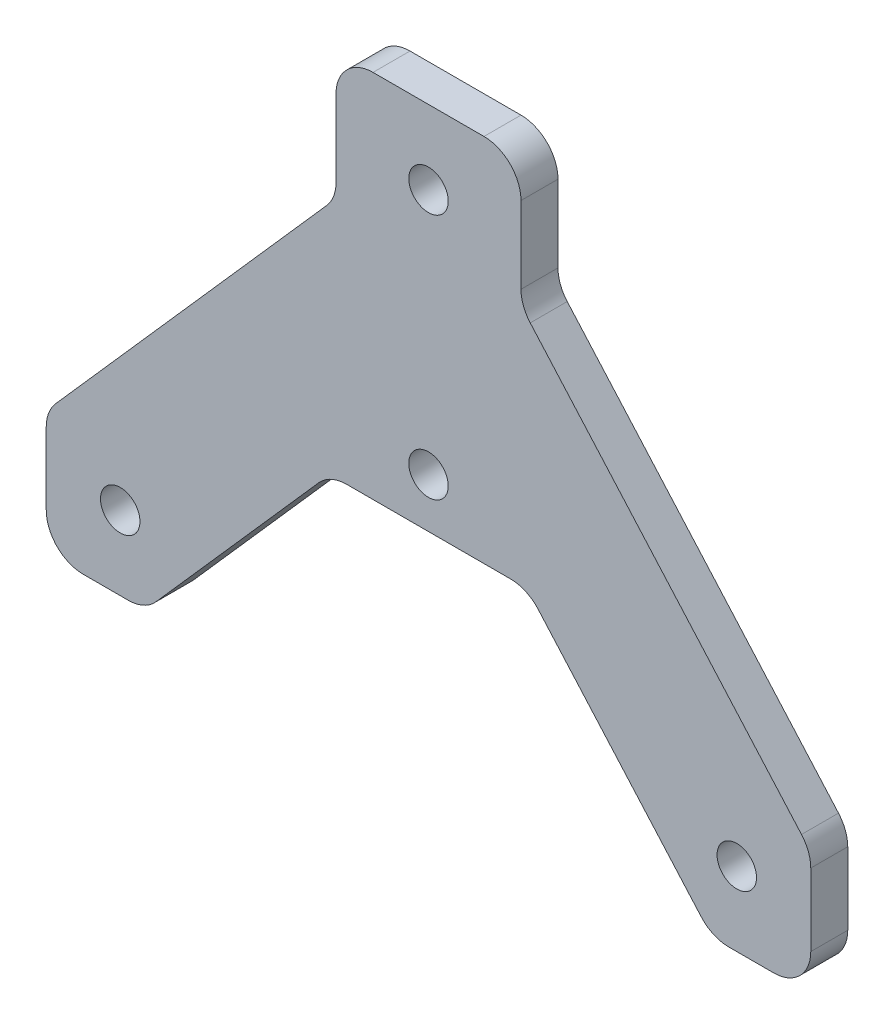
ISO-10303-21;
HEADER;
FILE_DESCRIPTION(('STEP AP214'),'2;1');
FILE_NAME('part.step','',(''),(''),'','','');
FILE_SCHEMA(('AUTOMOTIVE_DESIGN { 1 0 10303 214 1 1 1 1 }'));
ENDSEC;
DATA;
#1=APPLICATION_CONTEXT('core data for automotive mechanical design processes');
#2=APPLICATION_PROTOCOL_DEFINITION('international standard','automotive_design',2000,#1);
#3=PRODUCT_CONTEXT('',#1,'mechanical');
#4=PRODUCT('Part','Part','',(#3));
#5=PRODUCT_RELATED_PRODUCT_CATEGORY('part','',(#4));
#6=PRODUCT_DEFINITION_FORMATION('','',#4);
#7=PRODUCT_DEFINITION_CONTEXT('part definition',#1,'design');
#8=PRODUCT_DEFINITION('design','',#6,#7);
#9=PRODUCT_DEFINITION_SHAPE('','',#8);
#10=(LENGTH_UNIT() NAMED_UNIT(*) SI_UNIT(.MILLI.,.METRE.));
#11=(NAMED_UNIT(*) PLANE_ANGLE_UNIT() SI_UNIT($,.RADIAN.));
#12=(NAMED_UNIT(*) SI_UNIT($,.STERADIAN.) SOLID_ANGLE_UNIT());
#13=UNCERTAINTY_MEASURE_WITH_UNIT(LENGTH_MEASURE(1.E-05),#10,'distance_accuracy_value','');
#14=(GEOMETRIC_REPRESENTATION_CONTEXT(3) GLOBAL_UNCERTAINTY_ASSIGNED_CONTEXT((#13)) GLOBAL_UNIT_ASSIGNED_CONTEXT((#10,
#11,#12)) REPRESENTATION_CONTEXT('',''));
#15=CARTESIAN_POINT('',(0.,0.,0.));
#16=DIRECTION('',(0.,0.,1.));
#17=DIRECTION('',(1.,0.,0.));
#18=AXIS2_PLACEMENT_3D('',#15,#16,#17);
#19=CARTESIAN_POINT('',(0.,0.,3.));
#20=DIRECTION('',(0.,0.,1.));
#21=DIRECTION('',(1.,0.,0.));
#22=AXIS2_PLACEMENT_3D('',#19,#20,#21);
#23=PLANE('',#22);
#24=CARTESIAN_POINT('',(0.,35.,3.));
#25=DIRECTION('',(0.,0.,1.));
#26=DIRECTION('',(1.,0.,0.));
#27=AXIS2_PLACEMENT_3D('',#24,#25,#26);
#28=CIRCLE('',#27,1.6);
#29=CARTESIAN_POINT('',(1.6,35.,3.));
#30=VERTEX_POINT('',#29);
#31=EDGE_CURVE('E632',#30,#30,#28,.T.);
#32=ORIENTED_EDGE('',*,*,#31,.F.);
#33=EDGE_LOOP('',(#32));
#34=FACE_BOUND('',#33,.T.);
#35=CARTESIAN_POINT('',(-25.,0.,3.));
#36=DIRECTION('',(0.,0.,1.));
#37=DIRECTION('',(1.,0.,0.));
#38=AXIS2_PLACEMENT_3D('',#35,#36,#37);
#39=CIRCLE('',#38,1.6);
#40=CARTESIAN_POINT('',(-23.4,0.,3.));
#41=VERTEX_POINT('',#40);
#42=EDGE_CURVE('E240',#41,#41,#39,.T.);
#43=ORIENTED_EDGE('',*,*,#42,.F.);
#44=EDGE_LOOP('',(#43));
#45=FACE_BOUND('',#44,.T.);
#46=DIRECTION('',(0.661621637086846,-0.749837855365093,0.));
#47=VECTOR('',#46,1.);
#48=CARTESIAN_POINT('',(8.,11.,3.));
#49=LINE('',#48,#47);
#50=CARTESIAN_POINT('',(8.8957074312407,9.98486491126054,3.));
#51=VERTEX_POINT('',#50);
#52=CARTESIAN_POINT('',(22.1042925687593,-4.98486491126054,3.));
#53=VERTEX_POINT('',#52);
#54=EDGE_CURVE('E251',#51,#53,#49,.T.);
#55=ORIENTED_EDGE('',*,*,#54,.T.);
#56=CARTESIAN_POINT('',(24.3538061348546,-3.00000000000001,3.));
#57=DIRECTION('',(0.,0.,1.));
#58=DIRECTION('',(1.,0.,0.));
#59=AXIS2_PLACEMENT_3D('',#56,#57,#58);
#60=CIRCLE('',#59,3.);
#61=CARTESIAN_POINT('',(24.3538061348546,-6.00000000000001,3.));
#62=VERTEX_POINT('',#61);
#63=EDGE_CURVE('E337',#53,#62,#60,.T.);
#64=ORIENTED_EDGE('',*,*,#63,.T.);
#65=DIRECTION('',(1.,0.,0.));
#66=VECTOR('',#65,1.);
#67=CARTESIAN_POINT('',(23.,-6.00000000000001,3.));
#68=LINE('',#67,#66);
#69=CARTESIAN_POINT('',(28.,-6.00000000000001,3.));
#70=VERTEX_POINT('',#69);
#71=EDGE_CURVE('E229',#62,#70,#68,.T.);
#72=ORIENTED_EDGE('',*,*,#71,.T.);
#73=CARTESIAN_POINT('',(28.,-3.00000000000001,3.));
#74=DIRECTION('',(0.,0.,1.));
#75=DIRECTION('',(1.,0.,0.));
#76=AXIS2_PLACEMENT_3D('',#73,#74,#75);
#77=CIRCLE('',#76,3.);
#78=CARTESIAN_POINT('',(31.,-3.00000000000001,3.));
#79=VERTEX_POINT('',#78);
#80=EDGE_CURVE('E319',#70,#79,#77,.T.);
#81=ORIENTED_EDGE('',*,*,#80,.T.);
#82=DIRECTION('',(0.,1.,0.));
#83=VECTOR('',#82,1.);
#84=CARTESIAN_POINT('',(31.,-6.00000000000001,3.));
#85=LINE('',#84,#83);
#86=CARTESIAN_POINT('',(31.,2.86568638049814,3.));
#87=VERTEX_POINT('',#86);
#88=EDGE_CURVE('E456',#79,#87,#85,.T.);
#89=ORIENTED_EDGE('',*,*,#88,.T.);
#90=CARTESIAN_POINT('',(28.,2.86568638049814,3.));
#91=DIRECTION('',(0.,0.,1.));
#92=DIRECTION('',(1.,0.,0.));
#93=AXIS2_PLACEMENT_3D('',#90,#91,#92);
#94=CIRCLE('',#93,3.);
#95=CARTESIAN_POINT('',(30.2495135660953,4.85055129175868,3.));
#96=VERTEX_POINT('',#95);
#97=EDGE_CURVE('E322',#87,#96,#94,.T.);
#98=ORIENTED_EDGE('',*,*,#97,.T.);
#99=DIRECTION('',(-0.661621637086846,0.749837855365093,0.));
#100=VECTOR('',#99,1.);
#101=CARTESIAN_POINT('',(31.,3.99999999999999,3.));
#102=LINE('',#101,#100);
#103=CARTESIAN_POINT('',(8.25048643390472,29.7827820415747,3.));
#104=VERTEX_POINT('',#103);
#105=EDGE_CURVE('E444',#96,#104,#102,.T.);
#106=ORIENTED_EDGE('',*,*,#105,.T.);
#107=CARTESIAN_POINT('',(10.5,31.7676469528352,3.));
#108=DIRECTION('',(0.,0.,1.));
#109=DIRECTION('',(1.,0.,0.));
#110=AXIS2_PLACEMENT_3D('',#107,#108,#109);
#111=CIRCLE('',#110,3.);
#112=CARTESIAN_POINT('',(7.5,31.7676469528352,3.));
#113=VERTEX_POINT('',#112);
#114=EDGE_CURVE('E11',#104,#113,#111,.F.);
#115=ORIENTED_EDGE('',*,*,#114,.T.);
#116=DIRECTION('',(0.,1.,0.));
#117=VECTOR('',#116,1.);
#118=CARTESIAN_POINT('',(7.5,30.6333333333333,3.));
#119=LINE('',#118,#117);
#120=CARTESIAN_POINT('',(7.5,38.,3.));
#121=VERTEX_POINT('',#120);
#122=EDGE_CURVE('E442',#113,#121,#119,.T.);
#123=ORIENTED_EDGE('',*,*,#122,.T.);
#124=CARTESIAN_POINT('',(4.5,38.,3.));
#125=DIRECTION('',(0.,0.,1.));
#126=DIRECTION('',(1.,0.,0.));
#127=AXIS2_PLACEMENT_3D('',#124,#125,#126);
#128=CIRCLE('',#127,3.);
#129=CARTESIAN_POINT('',(4.5,41.,3.));
#130=VERTEX_POINT('',#129);
#131=EDGE_CURVE('E316',#121,#130,#128,.T.);
#132=ORIENTED_EDGE('',*,*,#131,.T.);
#133=DIRECTION('',(-1.,0.,0.));
#134=VECTOR('',#133,1.);
#135=CARTESIAN_POINT('',(-7.5,41.,3.));
#136=LINE('',#135,#134);
#137=CARTESIAN_POINT('',(-4.5,41.,3.));
#138=VERTEX_POINT('',#137);
#139=EDGE_CURVE('E449',#130,#138,#136,.T.);
#140=ORIENTED_EDGE('',*,*,#139,.T.);
#141=CARTESIAN_POINT('',(-4.5,38.,3.));
#142=DIRECTION('',(0.,0.,1.));
#143=DIRECTION('',(1.,0.,0.));
#144=AXIS2_PLACEMENT_3D('',#141,#142,#143);
#145=CIRCLE('',#144,3.);
#146=CARTESIAN_POINT('',(-7.5,38.,3.));
#147=VERTEX_POINT('',#146);
#148=EDGE_CURVE('E325',#138,#147,#145,.T.);
#149=ORIENTED_EDGE('',*,*,#148,.T.);
#150=DIRECTION('',(0.,-1.,0.));
#151=VECTOR('',#150,1.);
#152=CARTESIAN_POINT('',(-7.5,30.6333333333333,3.));
#153=LINE('',#152,#151);
#154=CARTESIAN_POINT('',(-7.5,31.7676469528352,3.));
#155=VERTEX_POINT('',#154);
#156=EDGE_CURVE('E454',#147,#155,#153,.T.);
#157=ORIENTED_EDGE('',*,*,#156,.T.);
#158=CARTESIAN_POINT('',(-10.5,31.7676469528352,3.));
#159=DIRECTION('',(0.,0.,1.));
#160=DIRECTION('',(1.,0.,0.));
#161=AXIS2_PLACEMENT_3D('',#158,#159,#160);
#162=CIRCLE('',#161,3.);
#163=CARTESIAN_POINT('',(-8.25048643390472,29.7827820415747,3.));
#164=VERTEX_POINT('',#163);
#165=EDGE_CURVE('E423',#155,#164,#162,.F.);
#166=ORIENTED_EDGE('',*,*,#165,.T.);
#167=DIRECTION('',(-0.661621637086846,-0.749837855365093,0.));
#168=VECTOR('',#167,1.);
#169=CARTESIAN_POINT('',(-31.,3.99999999999999,3.));
#170=LINE('',#169,#168);
#171=CARTESIAN_POINT('',(-30.2495135660953,4.85055129175868,3.));
#172=VERTEX_POINT('',#171);
#173=EDGE_CURVE('E463',#164,#172,#170,.T.);
#174=ORIENTED_EDGE('',*,*,#173,.T.);
#175=CARTESIAN_POINT('',(-28.,2.86568638049814,3.));
#176=DIRECTION('',(0.,0.,1.));
#177=DIRECTION('',(1.,0.,0.));
#178=AXIS2_PLACEMENT_3D('',#175,#176,#177);
#179=CIRCLE('',#178,3.);
#180=CARTESIAN_POINT('',(-31.,2.86568638049814,3.));
#181=VERTEX_POINT('',#180);
#182=EDGE_CURVE('E328',#172,#181,#179,.T.);
#183=ORIENTED_EDGE('',*,*,#182,.T.);
#184=DIRECTION('',(0.,-1.,0.));
#185=VECTOR('',#184,1.);
#186=CARTESIAN_POINT('',(-31.,-6.00000000000001,3.));
#187=LINE('',#186,#185);
#188=CARTESIAN_POINT('',(-31.,-3.00000000000001,3.));
#189=VERTEX_POINT('',#188);
#190=EDGE_CURVE('E467',#181,#189,#187,.T.);
#191=ORIENTED_EDGE('',*,*,#190,.T.);
#192=CARTESIAN_POINT('',(-28.,-3.00000000000001,3.));
#193=DIRECTION('',(0.,0.,1.));
#194=DIRECTION('',(1.,0.,0.));
#195=AXIS2_PLACEMENT_3D('',#192,#193,#194);
#196=CIRCLE('',#195,3.);
#197=CARTESIAN_POINT('',(-28.,-6.00000000000001,3.));
#198=VERTEX_POINT('',#197);
#199=EDGE_CURVE('E331',#189,#198,#196,.T.);
#200=ORIENTED_EDGE('',*,*,#199,.T.);
#201=DIRECTION('',(1.,0.,0.));
#202=VECTOR('',#201,1.);
#203=CARTESIAN_POINT('',(-23.,-6.00000000000001,3.));
#204=LINE('',#203,#202);
#205=CARTESIAN_POINT('',(-24.3538061348546,-6.00000000000001,3.));
#206=VERTEX_POINT('',#205);
#207=EDGE_CURVE('E471',#198,#206,#204,.T.);
#208=ORIENTED_EDGE('',*,*,#207,.T.);
#209=CARTESIAN_POINT('',(-24.3538061348546,-3.00000000000001,3.));
#210=DIRECTION('',(0.,0.,1.));
#211=DIRECTION('',(1.,0.,0.));
#212=AXIS2_PLACEMENT_3D('',#209,#210,#211);
#213=CIRCLE('',#212,3.);
#214=CARTESIAN_POINT('',(-22.1042925687593,-4.98486491126055,3.));
#215=VERTEX_POINT('',#214);
#216=EDGE_CURVE('E334',#206,#215,#213,.T.);
#217=ORIENTED_EDGE('',*,*,#216,.T.);
#218=DIRECTION('',(0.661621637086846,0.749837855365093,0.));
#219=VECTOR('',#218,1.);
#220=CARTESIAN_POINT('',(-8.,11.,3.));
#221=LINE('',#220,#219);
#222=CARTESIAN_POINT('',(-8.8957074312407,9.98486491126054,3.));
#223=VERTEX_POINT('',#222);
#224=EDGE_CURVE('E475',#215,#223,#221,.T.);
#225=ORIENTED_EDGE('',*,*,#224,.T.);
#226=CARTESIAN_POINT('',(-6.64619386514542,8.,3.));
#227=DIRECTION('',(0.,0.,1.));
#228=DIRECTION('',(1.,0.,0.));
#229=AXIS2_PLACEMENT_3D('',#226,#227,#228);
#230=CIRCLE('',#229,3.);
#231=CARTESIAN_POINT('',(-6.64619386514542,11.,3.));
#232=VERTEX_POINT('',#231);
#233=EDGE_CURVE('E68',#223,#232,#230,.F.);
#234=ORIENTED_EDGE('',*,*,#233,.T.);
#235=DIRECTION('',(1.,0.,0.));
#236=VECTOR('',#235,1.);
#237=CARTESIAN_POINT('',(8.,11.,3.));
#238=LINE('',#237,#236);
#239=CARTESIAN_POINT('',(6.64619386514542,11.,3.));
#240=VERTEX_POINT('',#239);
#241=EDGE_CURVE('E477',#232,#240,#238,.T.);
#242=ORIENTED_EDGE('',*,*,#241,.T.);
#243=CARTESIAN_POINT('',(6.64619386514542,8.,3.));
#244=DIRECTION('',(0.,0.,1.));
#245=DIRECTION('',(1.,0.,0.));
#246=AXIS2_PLACEMENT_3D('',#243,#244,#245);
#247=CIRCLE('',#246,3.);
#248=EDGE_CURVE('E412',#240,#51,#247,.F.);
#249=ORIENTED_EDGE('',*,*,#248,.T.);
#250=EDGE_LOOP('',(#55,#64,#72,#81,#89,#98,#106,#115,#123,#132,#140,#149,#157,#166,#174,#183,
#191,#200,#208,#217,#225,#234,#242,#249));
#251=FACE_BOUND('',#250,.T.);
#252=CARTESIAN_POINT('',(25.,0.,3.));
#253=DIRECTION('',(0.,0.,1.));
#254=DIRECTION('',(1.,0.,0.));
#255=AXIS2_PLACEMENT_3D('',#252,#253,#254);
#256=CIRCLE('',#255,1.6);
#257=CARTESIAN_POINT('',(26.6,0.,3.));
#258=VERTEX_POINT('',#257);
#259=EDGE_CURVE('E626',#258,#258,#256,.T.);
#260=ORIENTED_EDGE('',*,*,#259,.F.);
#261=EDGE_LOOP('',(#260));
#262=FACE_BOUND('',#261,.T.);
#263=CARTESIAN_POINT('',(0.,15.,3.));
#264=DIRECTION('',(0.,0.,1.));
#265=DIRECTION('',(1.,0.,0.));
#266=AXIS2_PLACEMENT_3D('',#263,#264,#265);
#267=CIRCLE('',#266,1.59999999999995);
#268=CARTESIAN_POINT('',(1.59999999999995,15.,3.));
#269=VERTEX_POINT('',#268);
#270=EDGE_CURVE('E640',#269,#269,#267,.T.);
#271=ORIENTED_EDGE('',*,*,#270,.F.);
#272=EDGE_LOOP('',(#271));
#273=FACE_BOUND('',#272,.T.);
#274=ADVANCED_FACE('F45',(#34,#45,#251,#262,#273),#23,.T.);
#275=CARTESIAN_POINT('',(0.,0.,0.));
#276=DIRECTION('',(0.,0.,1.));
#277=DIRECTION('',(1.,0.,0.));
#278=AXIS2_PLACEMENT_3D('',#275,#276,#277);
#279=PLANE('',#278);
#280=DIRECTION('',(1.,0.,0.));
#281=VECTOR('',#280,1.);
#282=CARTESIAN_POINT('',(23.,-6.00000000000001,0.));
#283=LINE('',#282,#281);
#284=CARTESIAN_POINT('',(24.3538061348546,-6.00000000000001,0.));
#285=VERTEX_POINT('',#284);
#286=CARTESIAN_POINT('',(28.,-6.00000000000001,0.));
#287=VERTEX_POINT('',#286);
#288=EDGE_CURVE('E226',#285,#287,#283,.T.);
#289=ORIENTED_EDGE('',*,*,#288,.F.);
#290=CARTESIAN_POINT('',(24.3538061348546,-3.00000000000001,0.));
#291=DIRECTION('',(0.,0.,1.));
#292=DIRECTION('',(1.,0.,0.));
#293=AXIS2_PLACEMENT_3D('',#290,#291,#292);
#294=CIRCLE('',#293,3.);
#295=CARTESIAN_POINT('',(22.1042925687593,-4.98486491126054,0.));
#296=VERTEX_POINT('',#295);
#297=EDGE_CURVE('E208',#285,#296,#294,.F.);
#298=ORIENTED_EDGE('',*,*,#297,.T.);
#299=DIRECTION('',(0.661621637086846,-0.749837855365093,0.));
#300=VECTOR('',#299,1.);
#301=CARTESIAN_POINT('',(8.,11.,0.));
#302=LINE('',#301,#300);
#303=CARTESIAN_POINT('',(8.8957074312407,9.98486491126054,0.));
#304=VERTEX_POINT('',#303);
#305=EDGE_CURVE('E288',#304,#296,#302,.T.);
#306=ORIENTED_EDGE('',*,*,#305,.F.);
#307=CARTESIAN_POINT('',(6.64619386514542,8.,0.));
#308=DIRECTION('',(0.,0.,1.));
#309=DIRECTION('',(1.,0.,0.));
#310=AXIS2_PLACEMENT_3D('',#307,#308,#309);
#311=CIRCLE('',#310,3.);
#312=CARTESIAN_POINT('',(6.64619386514542,11.,0.));
#313=VERTEX_POINT('',#312);
#314=EDGE_CURVE('E409',#304,#313,#311,.T.);
#315=ORIENTED_EDGE('',*,*,#314,.T.);
#316=DIRECTION('',(1.,0.,0.));
#317=VECTOR('',#316,1.);
#318=CARTESIAN_POINT('',(8.,11.,0.));
#319=LINE('',#318,#317);
#320=CARTESIAN_POINT('',(-6.64619386514542,11.,0.));
#321=VERTEX_POINT('',#320);
#322=EDGE_CURVE('E285',#321,#313,#319,.T.);
#323=ORIENTED_EDGE('',*,*,#322,.F.);
#324=CARTESIAN_POINT('',(-6.64619386514542,8.,0.));
#325=DIRECTION('',(0.,0.,1.));
#326=DIRECTION('',(1.,0.,0.));
#327=AXIS2_PLACEMENT_3D('',#324,#325,#326);
#328=CIRCLE('',#327,3.);
#329=CARTESIAN_POINT('',(-8.8957074312407,9.98486491126054,0.));
#330=VERTEX_POINT('',#329);
#331=EDGE_CURVE('E415',#321,#330,#328,.T.);
#332=ORIENTED_EDGE('',*,*,#331,.T.);
#333=DIRECTION('',(0.661621637086846,0.749837855365093,0.));
#334=VECTOR('',#333,1.);
#335=CARTESIAN_POINT('',(-8.,11.,0.));
#336=LINE('',#335,#334);
#337=CARTESIAN_POINT('',(-22.1042925687593,-4.98486491126055,0.));
#338=VERTEX_POINT('',#337);
#339=EDGE_CURVE('E281',#338,#330,#336,.T.);
#340=ORIENTED_EDGE('',*,*,#339,.F.);
#341=CARTESIAN_POINT('',(-24.3538061348546,-3.00000000000001,0.));
#342=DIRECTION('',(0.,0.,1.));
#343=DIRECTION('',(1.,0.,0.));
#344=AXIS2_PLACEMENT_3D('',#341,#342,#343);
#345=CIRCLE('',#344,3.);
#346=CARTESIAN_POINT('',(-24.3538061348546,-6.00000000000001,0.));
#347=VERTEX_POINT('',#346);
#348=EDGE_CURVE('E220',#338,#347,#345,.F.);
#349=ORIENTED_EDGE('',*,*,#348,.T.);
#350=DIRECTION('',(1.,0.,0.));
#351=VECTOR('',#350,1.);
#352=CARTESIAN_POINT('',(-23.,-6.00000000000001,0.));
#353=LINE('',#352,#351);
#354=CARTESIAN_POINT('',(-28.,-6.00000000000001,0.));
#355=VERTEX_POINT('',#354);
#356=EDGE_CURVE('E277',#355,#347,#353,.T.);
#357=ORIENTED_EDGE('',*,*,#356,.F.);
#358=CARTESIAN_POINT('',(-28.,-3.00000000000001,0.));
#359=DIRECTION('',(0.,0.,1.));
#360=DIRECTION('',(1.,0.,0.));
#361=AXIS2_PLACEMENT_3D('',#358,#359,#360);
#362=CIRCLE('',#361,3.);
#363=CARTESIAN_POINT('',(-31.,-3.00000000000001,0.));
#364=VERTEX_POINT('',#363);
#365=EDGE_CURVE('E306',#355,#364,#362,.F.);
#366=ORIENTED_EDGE('',*,*,#365,.T.);
#367=DIRECTION('',(0.,-1.,0.));
#368=VECTOR('',#367,1.);
#369=CARTESIAN_POINT('',(-31.,-6.00000000000001,0.));
#370=LINE('',#369,#368);
#371=CARTESIAN_POINT('',(-31.,2.86568638049814,0.));
#372=VERTEX_POINT('',#371);
#373=EDGE_CURVE('E273',#372,#364,#370,.T.);
#374=ORIENTED_EDGE('',*,*,#373,.F.);
#375=CARTESIAN_POINT('',(-28.,2.86568638049814,0.));
#376=DIRECTION('',(0.,0.,1.));
#377=DIRECTION('',(1.,0.,0.));
#378=AXIS2_PLACEMENT_3D('',#375,#376,#377);
#379=CIRCLE('',#378,3.);
#380=CARTESIAN_POINT('',(-30.2495135660953,4.85055129175868,0.));
#381=VERTEX_POINT('',#380);
#382=EDGE_CURVE('E303',#372,#381,#379,.F.);
#383=ORIENTED_EDGE('',*,*,#382,.T.);
#384=DIRECTION('',(-0.661621637086846,-0.749837855365093,0.));
#385=VECTOR('',#384,1.);
#386=CARTESIAN_POINT('',(-31.,3.99999999999999,0.));
#387=LINE('',#386,#385);
#388=CARTESIAN_POINT('',(-8.25048643390472,29.7827820415747,0.));
#389=VERTEX_POINT('',#388);
#390=EDGE_CURVE('E269',#389,#381,#387,.T.);
#391=ORIENTED_EDGE('',*,*,#390,.F.);
#392=CARTESIAN_POINT('',(-10.5,31.7676469528352,0.));
#393=DIRECTION('',(0.,0.,1.));
#394=DIRECTION('',(1.,0.,0.));
#395=AXIS2_PLACEMENT_3D('',#392,#393,#394);
#396=CIRCLE('',#395,3.);
#397=CARTESIAN_POINT('',(-7.5,31.7676469528352,0.));
#398=VERTEX_POINT('',#397);
#399=EDGE_CURVE('E420',#389,#398,#396,.T.);
#400=ORIENTED_EDGE('',*,*,#399,.T.);
#401=DIRECTION('',(0.,-1.,0.));
#402=VECTOR('',#401,1.);
#403=CARTESIAN_POINT('',(-7.5,30.6333333333333,0.));
#404=LINE('',#403,#402);
#405=CARTESIAN_POINT('',(-7.5,38.,0.));
#406=VERTEX_POINT('',#405);
#407=EDGE_CURVE('E265',#406,#398,#404,.T.);
#408=ORIENTED_EDGE('',*,*,#407,.F.);
#409=CARTESIAN_POINT('',(-4.5,38.,0.));
#410=DIRECTION('',(0.,0.,1.));
#411=DIRECTION('',(1.,0.,0.));
#412=AXIS2_PLACEMENT_3D('',#409,#410,#411);
#413=CIRCLE('',#412,3.);
#414=CARTESIAN_POINT('',(-4.5,41.,0.));
#415=VERTEX_POINT('',#414);
#416=EDGE_CURVE('E300',#406,#415,#413,.F.);
#417=ORIENTED_EDGE('',*,*,#416,.T.);
#418=DIRECTION('',(-1.,0.,0.));
#419=VECTOR('',#418,1.);
#420=CARTESIAN_POINT('',(-7.5,41.,0.));
#421=LINE('',#420,#419);
#422=CARTESIAN_POINT('',(4.5,41.,0.));
#423=VERTEX_POINT('',#422);
#424=EDGE_CURVE('E261',#423,#415,#421,.T.);
#425=ORIENTED_EDGE('',*,*,#424,.F.);
#426=CARTESIAN_POINT('',(4.5,38.,0.));
#427=DIRECTION('',(0.,0.,1.));
#428=DIRECTION('',(1.,0.,0.));
#429=AXIS2_PLACEMENT_3D('',#426,#427,#428);
#430=CIRCLE('',#429,3.);
#431=CARTESIAN_POINT('',(7.5,38.,0.));
#432=VERTEX_POINT('',#431);
#433=EDGE_CURVE('E231',#423,#432,#430,.F.);
#434=ORIENTED_EDGE('',*,*,#433,.T.);
#435=DIRECTION('',(0.,1.,0.));
#436=VECTOR('',#435,1.);
#437=CARTESIAN_POINT('',(7.5,30.6333333333333,0.));
#438=LINE('',#437,#436);
#439=CARTESIAN_POINT('',(7.5,31.7676469528352,0.));
#440=VERTEX_POINT('',#439);
#441=EDGE_CURVE('E257',#440,#432,#438,.T.);
#442=ORIENTED_EDGE('',*,*,#441,.F.);
#443=CARTESIAN_POINT('',(10.5,31.7676469528352,0.));
#444=DIRECTION('',(0.,0.,1.));
#445=DIRECTION('',(1.,0.,0.));
#446=AXIS2_PLACEMENT_3D('',#443,#444,#445);
#447=CIRCLE('',#446,3.);
#448=CARTESIAN_POINT('',(8.25048643390472,29.7827820415747,0.));
#449=VERTEX_POINT('',#448);
#450=EDGE_CURVE('E54',#440,#449,#447,.T.);
#451=ORIENTED_EDGE('',*,*,#450,.T.);
#452=DIRECTION('',(-0.661621637086846,0.749837855365093,0.));
#453=VECTOR('',#452,1.);
#454=CARTESIAN_POINT('',(31.,3.99999999999999,0.));
#455=LINE('',#454,#453);
#456=CARTESIAN_POINT('',(30.2495135660953,4.85055129175868,0.));
#457=VERTEX_POINT('',#456);
#458=EDGE_CURVE('E245',#457,#449,#455,.T.);
#459=ORIENTED_EDGE('',*,*,#458,.F.);
#460=CARTESIAN_POINT('',(28.,2.86568638049814,0.));
#461=DIRECTION('',(0.,0.,1.));
#462=DIRECTION('',(1.,0.,0.));
#463=AXIS2_PLACEMENT_3D('',#460,#461,#462);
#464=CIRCLE('',#463,3.);
#465=CARTESIAN_POINT('',(31.,2.86568638049814,0.));
#466=VERTEX_POINT('',#465);
#467=EDGE_CURVE('E297',#457,#466,#464,.F.);
#468=ORIENTED_EDGE('',*,*,#467,.T.);
#469=DIRECTION('',(0.,1.,0.));
#470=VECTOR('',#469,1.);
#471=CARTESIAN_POINT('',(31.,-6.00000000000001,0.));
#472=LINE('',#471,#470);
#473=CARTESIAN_POINT('',(31.,-3.00000000000001,0.));
#474=VERTEX_POINT('',#473);
#475=EDGE_CURVE('E239',#474,#466,#472,.T.);
#476=ORIENTED_EDGE('',*,*,#475,.F.);
#477=CARTESIAN_POINT('',(28.,-3.00000000000001,0.));
#478=DIRECTION('',(0.,0.,1.));
#479=DIRECTION('',(1.,0.,0.));
#480=AXIS2_PLACEMENT_3D('',#477,#478,#479);
#481=CIRCLE('',#480,3.);
#482=EDGE_CURVE('E237',#474,#287,#481,.F.);
#483=ORIENTED_EDGE('',*,*,#482,.T.);
#484=EDGE_LOOP('',(#289,#298,#306,#315,#323,#332,#340,#349,#357,#366,#374,#383,#391,#400,#408,
#417,#425,#434,#442,#451,#459,#468,#476,#483));
#485=FACE_BOUND('',#484,.T.);
#486=CARTESIAN_POINT('',(-25.,0.,0.));
#487=DIRECTION('',(0.,0.,1.));
#488=DIRECTION('',(1.,0.,0.));
#489=AXIS2_PLACEMENT_3D('',#486,#487,#488);
#490=CIRCLE('',#489,1.6);
#491=CARTESIAN_POINT('',(-23.4,0.,0.));
#492=VERTEX_POINT('',#491);
#493=EDGE_CURVE('E248',#492,#492,#490,.T.);
#494=ORIENTED_EDGE('',*,*,#493,.T.);
#495=EDGE_LOOP('',(#494));
#496=FACE_BOUND('',#495,.T.);
#497=CARTESIAN_POINT('',(25.,0.,0.));
#498=DIRECTION('',(0.,0.,1.));
#499=DIRECTION('',(1.,0.,0.));
#500=AXIS2_PLACEMENT_3D('',#497,#498,#499);
#501=CIRCLE('',#500,1.6);
#502=CARTESIAN_POINT('',(26.6,0.,0.));
#503=VERTEX_POINT('',#502);
#504=EDGE_CURVE('E628',#503,#503,#501,.T.);
#505=ORIENTED_EDGE('',*,*,#504,.T.);
#506=EDGE_LOOP('',(#505));
#507=FACE_BOUND('',#506,.T.);
#508=CARTESIAN_POINT('',(0.,35.,0.));
#509=DIRECTION('',(0.,0.,1.));
#510=DIRECTION('',(1.,0.,0.));
#511=AXIS2_PLACEMENT_3D('',#508,#509,#510);
#512=CIRCLE('',#511,1.6);
#513=CARTESIAN_POINT('',(1.6,35.,0.));
#514=VERTEX_POINT('',#513);
#515=EDGE_CURVE('E636',#514,#514,#512,.T.);
#516=ORIENTED_EDGE('',*,*,#515,.T.);
#517=EDGE_LOOP('',(#516));
#518=FACE_BOUND('',#517,.T.);
#519=CARTESIAN_POINT('',(0.,15.,0.));
#520=DIRECTION('',(0.,0.,1.));
#521=DIRECTION('',(1.,0.,0.));
#522=AXIS2_PLACEMENT_3D('',#519,#520,#521);
#523=CIRCLE('',#522,1.59999999999995);
#524=CARTESIAN_POINT('',(1.59999999999995,15.,0.));
#525=VERTEX_POINT('',#524);
#526=EDGE_CURVE('E644',#525,#525,#523,.T.);
#527=ORIENTED_EDGE('',*,*,#526,.T.);
#528=EDGE_LOOP('',(#527));
#529=FACE_BOUND('',#528,.T.);
#530=ADVANCED_FACE('F234',(#485,#496,#507,#518,#529),#279,.F.);
#531=CARTESIAN_POINT('',(23.,-6.00000000000001,3.));
#532=DIRECTION('',(0.,1.,0.));
#533=DIRECTION('',(-1.,0.,0.));
#534=AXIS2_PLACEMENT_3D('',#531,#532,#533);
#535=PLANE('',#534);
#536=ORIENTED_EDGE('',*,*,#71,.F.);
#537=DIRECTION('',(0.,0.,-1.));
#538=VECTOR('',#537,1.);
#539=CARTESIAN_POINT('',(24.3538061348546,-6.00000000000001,3.));
#540=LINE('',#539,#538);
#541=EDGE_CURVE('E212',#62,#285,#540,.T.);
#542=ORIENTED_EDGE('',*,*,#541,.T.);
#543=ORIENTED_EDGE('',*,*,#288,.T.);
#544=DIRECTION('',(0.,0.,-1.));
#545=VECTOR('',#544,1.);
#546=CARTESIAN_POINT('',(28.,-6.00000000000001,3.));
#547=LINE('',#546,#545);
#548=EDGE_CURVE('E232',#287,#70,#547,.F.);
#549=ORIENTED_EDGE('',*,*,#548,.T.);
#550=EDGE_LOOP('',(#536,#542,#543,#549));
#551=FACE_BOUND('',#550,.T.);
#552=ADVANCED_FACE('F225',(#551),#535,.F.);
#553=CARTESIAN_POINT('',(31.,-6.00000000000001,3.));
#554=DIRECTION('',(-1.,0.,0.));
#555=DIRECTION('',(0.,0.,1.));
#556=AXIS2_PLACEMENT_3D('',#553,#554,#555);
#557=PLANE('',#556);
#558=ORIENTED_EDGE('',*,*,#475,.T.);
#559=DIRECTION('',(0.,0.,-1.));
#560=VECTOR('',#559,1.);
#561=CARTESIAN_POINT('',(31.,2.86568638049814,3.));
#562=LINE('',#561,#560);
#563=EDGE_CURVE('E406',#466,#87,#562,.F.);
#564=ORIENTED_EDGE('',*,*,#563,.T.);
#565=ORIENTED_EDGE('',*,*,#88,.F.);
#566=DIRECTION('',(0.,0.,-1.));
#567=VECTOR('',#566,1.);
#568=CARTESIAN_POINT('',(31.,-3.00000000000001,3.));
#569=LINE('',#568,#567);
#570=EDGE_CURVE('E402',#79,#474,#569,.T.);
#571=ORIENTED_EDGE('',*,*,#570,.T.);
#572=EDGE_LOOP('',(#558,#564,#565,#571));
#573=FACE_BOUND('',#572,.T.);
#574=ADVANCED_FACE('F585',(#573),#557,.F.);
#575=CARTESIAN_POINT('',(31.,3.99999999999999,3.));
#576=DIRECTION('',(-0.749837855365093,-0.661621637086846,0.));
#577=DIRECTION('',(0.661621637086846,-0.749837855365093,0.));
#578=AXIS2_PLACEMENT_3D('',#575,#576,#577);
#579=PLANE('',#578);
#580=ORIENTED_EDGE('',*,*,#458,.T.);
#581=DIRECTION('',(0.,0.,-1.));
#582=VECTOR('',#581,1.);
#583=CARTESIAN_POINT('',(8.25048643390472,29.7827820415747,3.));
#584=LINE('',#583,#582);
#585=EDGE_CURVE('E399',#449,#104,#584,.F.);
#586=ORIENTED_EDGE('',*,*,#585,.T.);
#587=ORIENTED_EDGE('',*,*,#105,.F.);
#588=DIRECTION('',(0.,0.,-1.));
#589=VECTOR('',#588,1.);
#590=CARTESIAN_POINT('',(30.2495135660953,4.85055129175868,3.));
#591=LINE('',#590,#589);
#592=EDGE_CURVE('E395',#96,#457,#591,.T.);
#593=ORIENTED_EDGE('',*,*,#592,.T.);
#594=EDGE_LOOP('',(#580,#586,#587,#593));
#595=FACE_BOUND('',#594,.T.);
#596=ADVANCED_FACE('F432',(#595),#579,.F.);
#597=CARTESIAN_POINT('',(7.5,30.6333333333333,3.));
#598=DIRECTION('',(-1.,0.,0.));
#599=DIRECTION('',(0.,-1.,0.));
#600=AXIS2_PLACEMENT_3D('',#597,#598,#599);
#601=PLANE('',#600);
#602=ORIENTED_EDGE('',*,*,#122,.F.);
#603=DIRECTION('',(0.,0.,-1.));
#604=VECTOR('',#603,1.);
#605=CARTESIAN_POINT('',(7.5,31.7676469528352,0.));
#606=LINE('',#605,#604);
#607=EDGE_CURVE('E391',#113,#440,#606,.T.);
#608=ORIENTED_EDGE('',*,*,#607,.T.);
#609=ORIENTED_EDGE('',*,*,#441,.T.);
#610=DIRECTION('',(0.,0.,-1.));
#611=VECTOR('',#610,1.);
#612=CARTESIAN_POINT('',(7.5,38.,3.));
#613=LINE('',#612,#611);
#614=EDGE_CURVE('E388',#432,#121,#613,.F.);
#615=ORIENTED_EDGE('',*,*,#614,.T.);
#616=EDGE_LOOP('',(#602,#608,#609,#615));
#617=FACE_BOUND('',#616,.T.);
#618=ADVANCED_FACE('F446',(#617),#601,.F.);
#619=CARTESIAN_POINT('',(-7.5,41.,3.));
#620=DIRECTION('',(0.,-1.,0.));
#621=DIRECTION('',(0.,0.,-1.));
#622=AXIS2_PLACEMENT_3D('',#619,#620,#621);
#623=PLANE('',#622);
#624=ORIENTED_EDGE('',*,*,#424,.T.);
#625=DIRECTION('',(0.,0.,-1.));
#626=VECTOR('',#625,1.);
#627=CARTESIAN_POINT('',(-4.5,41.,3.));
#628=LINE('',#627,#626);
#629=EDGE_CURVE('E385',#415,#138,#628,.F.);
#630=ORIENTED_EDGE('',*,*,#629,.T.);
#631=ORIENTED_EDGE('',*,*,#139,.F.);
#632=DIRECTION('',(0.,0.,-1.));
#633=VECTOR('',#632,1.);
#634=CARTESIAN_POINT('',(4.5,41.,3.));
#635=LINE('',#634,#633);
#636=EDGE_CURVE('E381',#130,#423,#635,.T.);
#637=ORIENTED_EDGE('',*,*,#636,.T.);
#638=EDGE_LOOP('',(#624,#630,#631,#637));
#639=FACE_BOUND('',#638,.T.);
#640=ADVANCED_FACE('F540',(#639),#623,.F.);
#641=CARTESIAN_POINT('',(-7.5,30.6333333333333,3.));
#642=DIRECTION('',(1.,0.,0.));
#643=DIRECTION('',(0.,1.,0.));
#644=AXIS2_PLACEMENT_3D('',#641,#642,#643);
#645=PLANE('',#644);
#646=ORIENTED_EDGE('',*,*,#407,.T.);
#647=DIRECTION('',(0.,0.,-1.));
#648=VECTOR('',#647,1.);
#649=CARTESIAN_POINT('',(-7.5,31.7676469528352,3.));
#650=LINE('',#649,#648);
#651=EDGE_CURVE('E378',#398,#155,#650,.F.);
#652=ORIENTED_EDGE('',*,*,#651,.T.);
#653=ORIENTED_EDGE('',*,*,#156,.F.);
#654=DIRECTION('',(0.,0.,-1.));
#655=VECTOR('',#654,1.);
#656=CARTESIAN_POINT('',(-7.5,38.,3.));
#657=LINE('',#656,#655);
#658=EDGE_CURVE('E374',#147,#406,#657,.T.);
#659=ORIENTED_EDGE('',*,*,#658,.T.);
#660=EDGE_LOOP('',(#646,#652,#653,#659));
#661=FACE_BOUND('',#660,.T.);
#662=ADVANCED_FACE('F531',(#661),#645,.F.);
#663=CARTESIAN_POINT('',(-31.,3.99999999999999,3.));
#664=DIRECTION('',(0.749837855365093,-0.661621637086846,0.));
#665=DIRECTION('',(0.661621637086846,0.749837855365093,0.));
#666=AXIS2_PLACEMENT_3D('',#663,#664,#665);
#667=PLANE('',#666);
#668=ORIENTED_EDGE('',*,*,#390,.T.);
#669=DIRECTION('',(0.,0.,-1.));
#670=VECTOR('',#669,1.);
#671=CARTESIAN_POINT('',(-30.2495135660953,4.85055129175868,3.));
#672=LINE('',#671,#670);
#673=EDGE_CURVE('E371',#381,#172,#672,.F.);
#674=ORIENTED_EDGE('',*,*,#673,.T.);
#675=ORIENTED_EDGE('',*,*,#173,.F.);
#676=DIRECTION('',(0.,0.,-1.));
#677=VECTOR('',#676,1.);
#678=CARTESIAN_POINT('',(-8.25048643390472,29.7827820415747,0.));
#679=LINE('',#678,#677);
#680=EDGE_CURVE('E367',#164,#389,#679,.T.);
#681=ORIENTED_EDGE('',*,*,#680,.T.);
#682=EDGE_LOOP('',(#668,#674,#675,#681));
#683=FACE_BOUND('',#682,.T.);
#684=ADVANCED_FACE('F522',(#683),#667,.F.);
#685=CARTESIAN_POINT('',(-31.,-6.00000000000001,3.));
#686=DIRECTION('',(1.,0.,0.));
#687=DIRECTION('',(0.,0.,-1.));
#688=AXIS2_PLACEMENT_3D('',#685,#686,#687);
#689=PLANE('',#688);
#690=ORIENTED_EDGE('',*,*,#373,.T.);
#691=DIRECTION('',(0.,0.,-1.));
#692=VECTOR('',#691,1.);
#693=CARTESIAN_POINT('',(-31.,-3.00000000000001,3.));
#694=LINE('',#693,#692);
#695=EDGE_CURVE('E364',#364,#189,#694,.F.);
#696=ORIENTED_EDGE('',*,*,#695,.T.);
#697=ORIENTED_EDGE('',*,*,#190,.F.);
#698=DIRECTION('',(0.,0.,-1.));
#699=VECTOR('',#698,1.);
#700=CARTESIAN_POINT('',(-31.,2.86568638049814,3.));
#701=LINE('',#700,#699);
#702=EDGE_CURVE('E360',#181,#372,#701,.T.);
#703=ORIENTED_EDGE('',*,*,#702,.T.);
#704=EDGE_LOOP('',(#690,#696,#697,#703));
#705=FACE_BOUND('',#704,.T.);
#706=ADVANCED_FACE('F513',(#705),#689,.F.);
#707=CARTESIAN_POINT('',(-23.,-6.00000000000001,3.));
#708=DIRECTION('',(0.,1.,0.));
#709=DIRECTION('',(-1.,0.,0.));
#710=AXIS2_PLACEMENT_3D('',#707,#708,#709);
#711=PLANE('',#710);
#712=ORIENTED_EDGE('',*,*,#356,.T.);
#713=DIRECTION('',(0.,0.,-1.));
#714=VECTOR('',#713,1.);
#715=CARTESIAN_POINT('',(-24.3538061348546,-6.00000000000001,3.));
#716=LINE('',#715,#714);
#717=EDGE_CURVE('E357',#347,#206,#716,.F.);
#718=ORIENTED_EDGE('',*,*,#717,.T.);
#719=ORIENTED_EDGE('',*,*,#207,.F.);
#720=DIRECTION('',(0.,0.,-1.));
#721=VECTOR('',#720,1.);
#722=CARTESIAN_POINT('',(-28.,-6.00000000000001,3.));
#723=LINE('',#722,#721);
#724=EDGE_CURVE('E353',#198,#355,#723,.T.);
#725=ORIENTED_EDGE('',*,*,#724,.T.);
#726=EDGE_LOOP('',(#712,#718,#719,#725));
#727=FACE_BOUND('',#726,.T.);
#728=ADVANCED_FACE('F504',(#727),#711,.F.);
#729=CARTESIAN_POINT('',(-8.,11.,3.));
#730=DIRECTION('',(-0.749837855365093,0.661621637086846,0.));
#731=DIRECTION('',(-0.661621637086846,-0.749837855365093,0.));
#732=AXIS2_PLACEMENT_3D('',#729,#730,#731);
#733=PLANE('',#732);
#734=ORIENTED_EDGE('',*,*,#339,.T.);
#735=DIRECTION('',(0.,0.,-1.));
#736=VECTOR('',#735,1.);
#737=CARTESIAN_POINT('',(-8.8957074312407,9.98486491126054,3.));
#738=LINE('',#737,#736);
#739=EDGE_CURVE('E350',#330,#223,#738,.F.);
#740=ORIENTED_EDGE('',*,*,#739,.T.);
#741=ORIENTED_EDGE('',*,*,#224,.F.);
#742=DIRECTION('',(0.,0.,-1.));
#743=VECTOR('',#742,1.);
#744=CARTESIAN_POINT('',(-22.1042925687593,-4.98486491126055,3.));
#745=LINE('',#744,#743);
#746=EDGE_CURVE('E346',#215,#338,#745,.T.);
#747=ORIENTED_EDGE('',*,*,#746,.T.);
#748=EDGE_LOOP('',(#734,#740,#741,#747));
#749=FACE_BOUND('',#748,.T.);
#750=ADVANCED_FACE('F495',(#749),#733,.F.);
#751=CARTESIAN_POINT('',(8.,11.,3.));
#752=DIRECTION('',(0.,1.,0.));
#753=DIRECTION('',(0.,0.,1.));
#754=AXIS2_PLACEMENT_3D('',#751,#752,#753);
#755=PLANE('',#754);
#756=ORIENTED_EDGE('',*,*,#322,.T.);
#757=DIRECTION('',(0.,0.,-1.));
#758=VECTOR('',#757,1.);
#759=CARTESIAN_POINT('',(6.64619386514542,11.,3.));
#760=LINE('',#759,#758);
#761=EDGE_CURVE('E61',#313,#240,#760,.F.);
#762=ORIENTED_EDGE('',*,*,#761,.T.);
#763=ORIENTED_EDGE('',*,*,#241,.F.);
#764=DIRECTION('',(0.,0.,-1.));
#765=VECTOR('',#764,1.);
#766=CARTESIAN_POINT('',(-6.64619386514542,11.,0.));
#767=LINE('',#766,#765);
#768=EDGE_CURVE('E340',#232,#321,#767,.T.);
#769=ORIENTED_EDGE('',*,*,#768,.T.);
#770=EDGE_LOOP('',(#756,#762,#763,#769));
#771=FACE_BOUND('',#770,.T.);
#772=ADVANCED_FACE('F488',(#771),#755,.F.);
#773=CARTESIAN_POINT('',(8.,11.,3.));
#774=DIRECTION('',(0.749837855365093,0.661621637086846,0.));
#775=DIRECTION('',(-0.661621637086846,0.749837855365093,0.));
#776=AXIS2_PLACEMENT_3D('',#773,#774,#775);
#777=PLANE('',#776);
#778=ORIENTED_EDGE('',*,*,#305,.T.);
#779=DIRECTION('',(0.,0.,-1.));
#780=VECTOR('',#779,1.);
#781=CARTESIAN_POINT('',(22.1042925687593,-4.98486491126054,3.));
#782=LINE('',#781,#780);
#783=EDGE_CURVE('E213',#296,#53,#782,.F.);
#784=ORIENTED_EDGE('',*,*,#783,.T.);
#785=ORIENTED_EDGE('',*,*,#54,.F.);
#786=DIRECTION('',(0.,0.,-1.));
#787=VECTOR('',#786,1.);
#788=CARTESIAN_POINT('',(8.8957074312407,9.98486491126054,0.));
#789=LINE('',#788,#787);
#790=EDGE_CURVE('E219',#51,#304,#789,.T.);
#791=ORIENTED_EDGE('',*,*,#790,.T.);
#792=EDGE_LOOP('',(#778,#784,#785,#791));
#793=FACE_BOUND('',#792,.T.);
#794=ADVANCED_FACE('F484',(#793),#777,.F.);
#795=CARTESIAN_POINT('',(-25.,0.,3.));
#796=DIRECTION('',(0.,0.,-1.));
#797=DIRECTION('',(-1.,0.,0.));
#798=AXIS2_PLACEMENT_3D('',#795,#796,#797);
#799=CYLINDRICAL_SURFACE('',#798,1.6);
#800=ORIENTED_EDGE('',*,*,#42,.T.);
#801=EDGE_LOOP('',(#800));
#802=FACE_BOUND('',#801,.T.);
#803=ORIENTED_EDGE('',*,*,#493,.F.);
#804=EDGE_LOOP('',(#803));
#805=FACE_BOUND('',#804,.T.);
#806=ADVANCED_FACE('F562',(#802,#805),#799,.F.);
#807=CARTESIAN_POINT('',(25.,0.,3.));
#808=DIRECTION('',(0.,0.,-1.));
#809=DIRECTION('',(-1.,0.,0.));
#810=AXIS2_PLACEMENT_3D('',#807,#808,#809);
#811=CYLINDRICAL_SURFACE('',#810,1.6);
#812=ORIENTED_EDGE('',*,*,#259,.T.);
#813=EDGE_LOOP('',(#812));
#814=FACE_BOUND('',#813,.T.);
#815=ORIENTED_EDGE('',*,*,#504,.F.);
#816=EDGE_LOOP('',(#815));
#817=FACE_BOUND('',#816,.T.);
#818=ADVANCED_FACE('F661',(#814,#817),#811,.F.);
#819=CARTESIAN_POINT('',(0.,35.,3.));
#820=DIRECTION('',(0.,0.,-1.));
#821=DIRECTION('',(-1.,0.,0.));
#822=AXIS2_PLACEMENT_3D('',#819,#820,#821);
#823=CYLINDRICAL_SURFACE('',#822,1.6);
#824=ORIENTED_EDGE('',*,*,#31,.T.);
#825=EDGE_LOOP('',(#824));
#826=FACE_BOUND('',#825,.T.);
#827=ORIENTED_EDGE('',*,*,#515,.F.);
#828=EDGE_LOOP('',(#827));
#829=FACE_BOUND('',#828,.T.);
#830=ADVANCED_FACE('F654',(#826,#829),#823,.F.);
#831=CARTESIAN_POINT('',(0.,15.,3.));
#832=DIRECTION('',(0.,0.,-1.));
#833=DIRECTION('',(-1.,0.,0.));
#834=AXIS2_PLACEMENT_3D('',#831,#832,#833);
#835=CYLINDRICAL_SURFACE('',#834,1.59999999999995);
#836=ORIENTED_EDGE('',*,*,#270,.T.);
#837=EDGE_LOOP('',(#836));
#838=FACE_BOUND('',#837,.T.);
#839=ORIENTED_EDGE('',*,*,#526,.F.);
#840=EDGE_LOOP('',(#839));
#841=FACE_BOUND('',#840,.T.);
#842=ADVANCED_FACE('F593',(#838,#841),#835,.F.);
#843=CARTESIAN_POINT('',(24.3538061348546,-3.00000000000001,3.));
#844=DIRECTION('',(0.,0.,-1.));
#845=DIRECTION('',(-1.,0.,0.));
#846=AXIS2_PLACEMENT_3D('',#843,#844,#845);
#847=CYLINDRICAL_SURFACE('',#846,3.);
#848=ORIENTED_EDGE('',*,*,#63,.F.);
#849=ORIENTED_EDGE('',*,*,#783,.F.);
#850=ORIENTED_EDGE('',*,*,#297,.F.);
#851=ORIENTED_EDGE('',*,*,#541,.F.);
#852=EDGE_LOOP('',(#848,#849,#850,#851));
#853=FACE_BOUND('',#852,.T.);
#854=ADVANCED_FACE('F211',(#853),#847,.T.);
#855=CARTESIAN_POINT('',(6.64619386514542,8.,3.));
#856=DIRECTION('',(0.,0.,1.));
#857=DIRECTION('',(1.,0.,0.));
#858=AXIS2_PLACEMENT_3D('',#855,#856,#857);
#859=CYLINDRICAL_SURFACE('',#858,3.);
#860=ORIENTED_EDGE('',*,*,#248,.F.);
#861=ORIENTED_EDGE('',*,*,#761,.F.);
#862=ORIENTED_EDGE('',*,*,#314,.F.);
#863=ORIENTED_EDGE('',*,*,#790,.F.);
#864=EDGE_LOOP('',(#860,#861,#862,#863));
#865=FACE_BOUND('',#864,.T.);
#866=ADVANCED_FACE('F486',(#865),#859,.F.);
#867=CARTESIAN_POINT('',(-6.64619386514542,8.,3.));
#868=DIRECTION('',(0.,0.,1.));
#869=DIRECTION('',(1.,0.,0.));
#870=AXIS2_PLACEMENT_3D('',#867,#868,#869);
#871=CYLINDRICAL_SURFACE('',#870,3.);
#872=ORIENTED_EDGE('',*,*,#233,.F.);
#873=ORIENTED_EDGE('',*,*,#739,.F.);
#874=ORIENTED_EDGE('',*,*,#331,.F.);
#875=ORIENTED_EDGE('',*,*,#768,.F.);
#876=EDGE_LOOP('',(#872,#873,#874,#875));
#877=FACE_BOUND('',#876,.T.);
#878=ADVANCED_FACE('F491',(#877),#871,.F.);
#879=CARTESIAN_POINT('',(-24.3538061348546,-3.00000000000001,3.));
#880=DIRECTION('',(0.,0.,-1.));
#881=DIRECTION('',(-1.,0.,0.));
#882=AXIS2_PLACEMENT_3D('',#879,#880,#881);
#883=CYLINDRICAL_SURFACE('',#882,3.);
#884=ORIENTED_EDGE('',*,*,#216,.F.);
#885=ORIENTED_EDGE('',*,*,#717,.F.);
#886=ORIENTED_EDGE('',*,*,#348,.F.);
#887=ORIENTED_EDGE('',*,*,#746,.F.);
#888=EDGE_LOOP('',(#884,#885,#886,#887));
#889=FACE_BOUND('',#888,.T.);
#890=ADVANCED_FACE('F500',(#889),#883,.T.);
#891=CARTESIAN_POINT('',(-28.,-3.00000000000001,3.));
#892=DIRECTION('',(0.,0.,-1.));
#893=DIRECTION('',(-1.,0.,0.));
#894=AXIS2_PLACEMENT_3D('',#891,#892,#893);
#895=CYLINDRICAL_SURFACE('',#894,3.);
#896=ORIENTED_EDGE('',*,*,#199,.F.);
#897=ORIENTED_EDGE('',*,*,#695,.F.);
#898=ORIENTED_EDGE('',*,*,#365,.F.);
#899=ORIENTED_EDGE('',*,*,#724,.F.);
#900=EDGE_LOOP('',(#896,#897,#898,#899));
#901=FACE_BOUND('',#900,.T.);
#902=ADVANCED_FACE('F509',(#901),#895,.T.);
#903=CARTESIAN_POINT('',(-28.,2.86568638049814,3.));
#904=DIRECTION('',(0.,0.,-1.));
#905=DIRECTION('',(-1.,0.,0.));
#906=AXIS2_PLACEMENT_3D('',#903,#904,#905);
#907=CYLINDRICAL_SURFACE('',#906,3.);
#908=ORIENTED_EDGE('',*,*,#182,.F.);
#909=ORIENTED_EDGE('',*,*,#673,.F.);
#910=ORIENTED_EDGE('',*,*,#382,.F.);
#911=ORIENTED_EDGE('',*,*,#702,.F.);
#912=EDGE_LOOP('',(#908,#909,#910,#911));
#913=FACE_BOUND('',#912,.T.);
#914=ADVANCED_FACE('F518',(#913),#907,.T.);
#915=CARTESIAN_POINT('',(-10.5,31.7676469528352,3.));
#916=DIRECTION('',(0.,0.,1.));
#917=DIRECTION('',(1.,0.,0.));
#918=AXIS2_PLACEMENT_3D('',#915,#916,#917);
#919=CYLINDRICAL_SURFACE('',#918,3.);
#920=ORIENTED_EDGE('',*,*,#165,.F.);
#921=ORIENTED_EDGE('',*,*,#651,.F.);
#922=ORIENTED_EDGE('',*,*,#399,.F.);
#923=ORIENTED_EDGE('',*,*,#680,.F.);
#924=EDGE_LOOP('',(#920,#921,#922,#923));
#925=FACE_BOUND('',#924,.T.);
#926=ADVANCED_FACE('F527',(#925),#919,.F.);
#927=CARTESIAN_POINT('',(-4.5,38.,3.));
#928=DIRECTION('',(0.,0.,-1.));
#929=DIRECTION('',(-1.,0.,0.));
#930=AXIS2_PLACEMENT_3D('',#927,#928,#929);
#931=CYLINDRICAL_SURFACE('',#930,3.);
#932=ORIENTED_EDGE('',*,*,#148,.F.);
#933=ORIENTED_EDGE('',*,*,#629,.F.);
#934=ORIENTED_EDGE('',*,*,#416,.F.);
#935=ORIENTED_EDGE('',*,*,#658,.F.);
#936=EDGE_LOOP('',(#932,#933,#934,#935));
#937=FACE_BOUND('',#936,.T.);
#938=ADVANCED_FACE('F536',(#937),#931,.T.);
#939=CARTESIAN_POINT('',(10.5,31.7676469528352,3.));
#940=DIRECTION('',(0.,0.,1.));
#941=DIRECTION('',(1.,0.,0.));
#942=AXIS2_PLACEMENT_3D('',#939,#940,#941);
#943=CYLINDRICAL_SURFACE('',#942,3.);
#944=ORIENTED_EDGE('',*,*,#114,.F.);
#945=ORIENTED_EDGE('',*,*,#585,.F.);
#946=ORIENTED_EDGE('',*,*,#450,.F.);
#947=ORIENTED_EDGE('',*,*,#607,.F.);
#948=EDGE_LOOP('',(#944,#945,#946,#947));
#949=FACE_BOUND('',#948,.T.);
#950=ADVANCED_FACE('F437',(#949),#943,.F.);
#951=CARTESIAN_POINT('',(28.,2.86568638049814,3.));
#952=DIRECTION('',(0.,0.,-1.));
#953=DIRECTION('',(-1.,0.,0.));
#954=AXIS2_PLACEMENT_3D('',#951,#952,#953);
#955=CYLINDRICAL_SURFACE('',#954,3.);
#956=ORIENTED_EDGE('',*,*,#97,.F.);
#957=ORIENTED_EDGE('',*,*,#563,.F.);
#958=ORIENTED_EDGE('',*,*,#467,.F.);
#959=ORIENTED_EDGE('',*,*,#592,.F.);
#960=EDGE_LOOP('',(#956,#957,#958,#959));
#961=FACE_BOUND('',#960,.T.);
#962=ADVANCED_FACE('F549',(#961),#955,.T.);
#963=CARTESIAN_POINT('',(28.,-3.00000000000001,3.));
#964=DIRECTION('',(0.,0.,-1.));
#965=DIRECTION('',(-1.,0.,0.));
#966=AXIS2_PLACEMENT_3D('',#963,#964,#965);
#967=CYLINDRICAL_SURFACE('',#966,3.);
#968=ORIENTED_EDGE('',*,*,#80,.F.);
#969=ORIENTED_EDGE('',*,*,#548,.F.);
#970=ORIENTED_EDGE('',*,*,#482,.F.);
#971=ORIENTED_EDGE('',*,*,#570,.F.);
#972=EDGE_LOOP('',(#968,#969,#970,#971));
#973=FACE_BOUND('',#972,.T.);
#974=ADVANCED_FACE('F545',(#973),#967,.T.);
#975=CARTESIAN_POINT('',(4.5,38.,3.));
#976=DIRECTION('',(0.,0.,-1.));
#977=DIRECTION('',(-1.,0.,0.));
#978=AXIS2_PLACEMENT_3D('',#975,#976,#977);
#979=CYLINDRICAL_SURFACE('',#978,3.);
#980=ORIENTED_EDGE('',*,*,#131,.F.);
#981=ORIENTED_EDGE('',*,*,#614,.F.);
#982=ORIENTED_EDGE('',*,*,#433,.F.);
#983=ORIENTED_EDGE('',*,*,#636,.F.);
#984=EDGE_LOOP('',(#980,#981,#982,#983));
#985=FACE_BOUND('',#984,.T.);
#986=ADVANCED_FACE('F47',(#985),#979,.T.);
#987=CLOSED_SHELL('',(#274,#530,#552,#574,#596,#618,#640,#662,#684,#706,#728,#750,#772,#794,
#806,#818,#830,#842,#854,#866,#878,#890,#902,#914,#926,#938,#950,#962,#974,#986));
#988=MANIFOLD_SOLID_BREP('B2',#987);
#989=ADVANCED_BREP_SHAPE_REPRESENTATION('',(#18,#988),#14);
#990=SHAPE_DEFINITION_REPRESENTATION(#9,#989);
ENDSEC;
END-ISO-10303-21;
